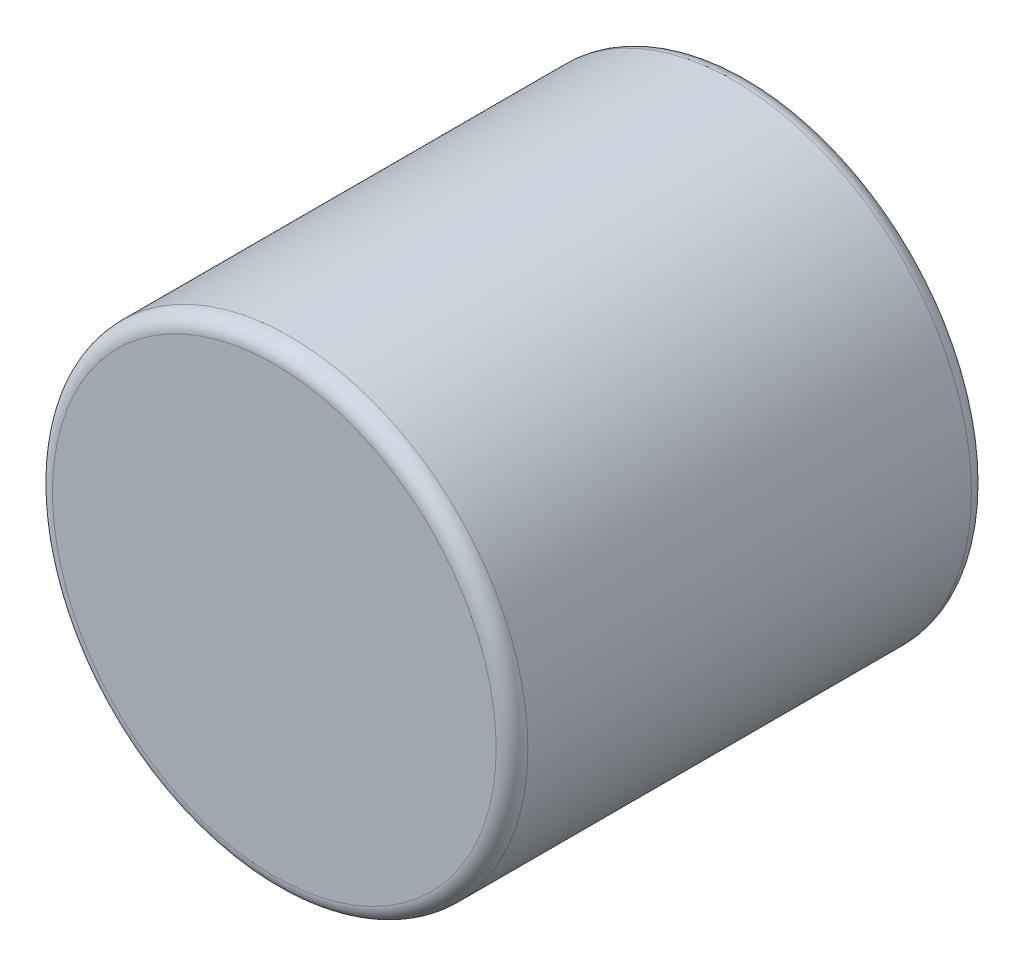
ISO-10303-21;
HEADER;
FILE_DESCRIPTION(('STEP AP214'),'2;1');
FILE_NAME('part.step','',(''),(''),'','','');
FILE_SCHEMA(('AUTOMOTIVE_DESIGN { 1 0 10303 214 1 1 1 1 }'));
ENDSEC;
DATA;
#1=APPLICATION_CONTEXT('core data for automotive mechanical design processes');
#2=APPLICATION_PROTOCOL_DEFINITION('international standard','automotive_design',2000,#1);
#3=PRODUCT_CONTEXT('',#1,'mechanical');
#4=PRODUCT('Part','Part','',(#3));
#5=PRODUCT_RELATED_PRODUCT_CATEGORY('part','',(#4));
#6=PRODUCT_DEFINITION_FORMATION('','',#4);
#7=PRODUCT_DEFINITION_CONTEXT('part definition',#1,'design');
#8=PRODUCT_DEFINITION('design','',#6,#7);
#9=PRODUCT_DEFINITION_SHAPE('','',#8);
#10=(LENGTH_UNIT() NAMED_UNIT(*) SI_UNIT(.MILLI.,.METRE.));
#11=(NAMED_UNIT(*) PLANE_ANGLE_UNIT() SI_UNIT($,.RADIAN.));
#12=(NAMED_UNIT(*) SI_UNIT($,.STERADIAN.) SOLID_ANGLE_UNIT());
#13=UNCERTAINTY_MEASURE_WITH_UNIT(LENGTH_MEASURE(1.E-05),#10,'distance_accuracy_value','');
#14=(GEOMETRIC_REPRESENTATION_CONTEXT(3) GLOBAL_UNCERTAINTY_ASSIGNED_CONTEXT((#13)) GLOBAL_UNIT_ASSIGNED_CONTEXT((#10,
#11,#12)) REPRESENTATION_CONTEXT('',''));
#15=CARTESIAN_POINT('',(0.,0.,0.));
#16=DIRECTION('',(0.,0.,1.));
#17=DIRECTION('',(1.,0.,0.));
#18=AXIS2_PLACEMENT_3D('',#15,#16,#17);
#19=CARTESIAN_POINT('',(0.,0.,30.));
#20=DIRECTION('',(0.,0.,-1.));
#21=DIRECTION('',(-1.,0.,0.));
#22=AXIS2_PLACEMENT_3D('',#19,#20,#21);
#23=CYLINDRICAL_SURFACE('',#22,15.);
#24=CARTESIAN_POINT('',(0.,0.,1.));
#25=DIRECTION('',(0.,0.,1.));
#26=DIRECTION('',(1.,0.,0.));
#27=AXIS2_PLACEMENT_3D('',#24,#25,#26);
#28=CIRCLE('',#27,15.);
#29=CARTESIAN_POINT('',(15.,0.,1.));
#30=VERTEX_POINT('',#29);
#31=EDGE_CURVE('E49',#30,#30,#28,.T.);
#32=ORIENTED_EDGE('',*,*,#31,.T.);
#33=EDGE_LOOP('',(#32));
#34=FACE_BOUND('',#33,.T.);
#35=CARTESIAN_POINT('',(0.,0.,29.));
#36=DIRECTION('',(0.,0.,1.));
#37=DIRECTION('',(1.,0.,0.));
#38=AXIS2_PLACEMENT_3D('',#35,#36,#37);
#39=CIRCLE('',#38,15.);
#40=CARTESIAN_POINT('',(15.,0.,29.));
#41=VERTEX_POINT('',#40);
#42=EDGE_CURVE('E53',#41,#41,#39,.F.);
#43=ORIENTED_EDGE('',*,*,#42,.T.);
#44=EDGE_LOOP('',(#43));
#45=FACE_BOUND('',#44,.T.);
#46=ADVANCED_FACE('F38',(#34,#45),#23,.T.);
#47=CARTESIAN_POINT('',(0.,0.,30.));
#48=DIRECTION('',(0.,0.,1.));
#49=DIRECTION('',(1.,0.,0.));
#50=AXIS2_PLACEMENT_3D('',#47,#48,#49);
#51=PLANE('',#50);
#52=CARTESIAN_POINT('',(0.,0.,30.));
#53=DIRECTION('',(0.,0.,1.));
#54=DIRECTION('',(1.,0.,0.));
#55=AXIS2_PLACEMENT_3D('',#52,#53,#54);
#56=CIRCLE('',#55,14.);
#57=CARTESIAN_POINT('',(14.,0.,30.));
#58=VERTEX_POINT('',#57);
#59=EDGE_CURVE('E10',#58,#58,#56,.T.);
#60=ORIENTED_EDGE('',*,*,#59,.T.);
#61=EDGE_LOOP('',(#60));
#62=FACE_BOUND('',#61,.T.);
#63=ADVANCED_FACE('F83',(#62),#51,.T.);
#64=CARTESIAN_POINT('',(0.,0.,0.));
#65=DIRECTION('',(0.,0.,1.));
#66=DIRECTION('',(1.,0.,0.));
#67=AXIS2_PLACEMENT_3D('',#64,#65,#66);
#68=PLANE('',#67);
#69=CARTESIAN_POINT('',(0.,0.,0.));
#70=DIRECTION('',(0.,0.,-1.));
#71=DIRECTION('',(-1.,0.,0.));
#72=AXIS2_PLACEMENT_3D('',#69,#70,#71);
#73=CIRCLE('',#72,3.);
#74=CARTESIAN_POINT('',(-3.,0.,0.));
#75=VERTEX_POINT('',#74);
#76=EDGE_CURVE('E58',#75,#75,#73,.T.);
#77=ORIENTED_EDGE('',*,*,#76,.F.);
#78=EDGE_LOOP('',(#77));
#79=FACE_BOUND('',#78,.T.);
#80=CARTESIAN_POINT('',(0.,0.,0.));
#81=DIRECTION('',(0.,0.,1.));
#82=DIRECTION('',(1.,0.,0.));
#83=AXIS2_PLACEMENT_3D('',#80,#81,#82);
#84=CIRCLE('',#83,14.);
#85=CARTESIAN_POINT('',(14.,0.,0.));
#86=VERTEX_POINT('',#85);
#87=EDGE_CURVE('E45',#86,#86,#84,.F.);
#88=ORIENTED_EDGE('',*,*,#87,.T.);
#89=EDGE_LOOP('',(#88));
#90=FACE_BOUND('',#89,.T.);
#91=ADVANCED_FACE('F89',(#79,#90),#68,.F.);
#92=CARTESIAN_POINT('',(0.,0.,1.));
#93=DIRECTION('',(0.,0.,1.));
#94=DIRECTION('',(1.,0.,0.));
#95=AXIS2_PLACEMENT_3D('',#92,#93,#94);
#96=TOROIDAL_SURFACE('',#95,14.,1.);
#97=ORIENTED_EDGE('',*,*,#87,.F.);
#98=EDGE_LOOP('',(#97));
#99=FACE_BOUND('',#98,.T.);
#100=ORIENTED_EDGE('',*,*,#31,.F.);
#101=EDGE_LOOP('',(#100));
#102=FACE_BOUND('',#101,.T.);
#103=ADVANCED_FACE('F93',(#99,#102),#96,.T.);
#104=CARTESIAN_POINT('',(0.,0.,29.));
#105=DIRECTION('',(0.,0.,1.));
#106=DIRECTION('',(1.,0.,0.));
#107=AXIS2_PLACEMENT_3D('',#104,#105,#106);
#108=TOROIDAL_SURFACE('',#107,14.,1.);
#109=ORIENTED_EDGE('',*,*,#42,.F.);
#110=EDGE_LOOP('',(#109));
#111=FACE_BOUND('',#110,.T.);
#112=ORIENTED_EDGE('',*,*,#59,.F.);
#113=EDGE_LOOP('',(#112));
#114=FACE_BOUND('',#113,.T.);
#115=ADVANCED_FACE('F40',(#111,#114),#108,.T.);
#116=CARTESIAN_POINT('',(0.,0.,0.));
#117=DIRECTION('',(0.,0.,-1.));
#118=DIRECTION('',(-1.,0.,0.));
#119=AXIS2_PLACEMENT_3D('',#116,#117,#118);
#120=TOROIDAL_SURFACE('',#119,1.5,1.5);
#121=ORIENTED_EDGE('',*,*,#76,.T.);
#122=EDGE_LOOP('',(#121));
#123=FACE_BOUND('',#122,.T.);
#124=CARTESIAN_POINT('',(0.,0.,1.41421356237309));
#125=DIRECTION('',(0.,0.,-1.));
#126=DIRECTION('',(-1.,0.,0.));
#127=AXIS2_PLACEMENT_3D('',#124,#125,#126);
#128=CIRCLE('',#127,2.);
#129=CARTESIAN_POINT('',(-2.,0.,1.41421356237309));
#130=VERTEX_POINT('',#129);
#131=EDGE_CURVE('E61',#130,#130,#128,.T.);
#132=ORIENTED_EDGE('',*,*,#131,.F.);
#133=EDGE_LOOP('',(#132));
#134=FACE_BOUND('',#133,.T.);
#135=ADVANCED_FACE('F72',(#123,#134),#120,.F.);
#136=CARTESIAN_POINT('',(0.,0.,1.07245097824471));
#137=DIRECTION('',(0.,0.,-1.));
#138=DIRECTION('',(-1.,0.,0.));
#139=AXIS2_PLACEMENT_3D('',#136,#137,#138);
#140=DEGENERATE_TOROIDAL_SURFACE('',#139,0.539452727197819,1.5,.T.);
#141=ORIENTED_EDGE('',*,*,#131,.T.);
#142=EDGE_LOOP('',(#141));
#143=FACE_BOUND('',#142,.T.);
#144=CARTESIAN_POINT('',(0.,0.,2.5));
#145=DIRECTION('',(0.,0.,-1.));
#146=DIRECTION('',(-1.,0.,0.));
#147=AXIS2_PLACEMENT_3D('',#144,#145,#146);
#148=CIRCLE('',#147,1.);
#149=CARTESIAN_POINT('',(-1.,0.,2.5));
#150=VERTEX_POINT('',#149);
#151=EDGE_CURVE('E64',#150,#150,#148,.T.);
#152=ORIENTED_EDGE('',*,*,#151,.F.);
#153=EDGE_LOOP('',(#152));
#154=FACE_BOUND('',#153,.T.);
#155=ADVANCED_FACE('F70',(#143,#154),#140,.F.);
#156=CARTESIAN_POINT('',(0.,0.,2.5));
#157=DIRECTION('',(0.,0.,-1.));
#158=DIRECTION('',(1.,0.,0.));
#159=AXIS2_PLACEMENT_3D('',#156,#157,#158);
#160=SPHERICAL_SURFACE('',#159,1.);
#161=ORIENTED_EDGE('',*,*,#151,.T.);
#162=EDGE_LOOP('',(#161));
#163=FACE_BOUND('',#162,.T.);
#164=ADVANCED_FACE('F68',(#163),#160,.T.);
#165=CLOSED_SHELL('',(#46,#63,#91,#103,#115,#135,#155,#164));
#166=MANIFOLD_SOLID_BREP('B2',#165);
#167=ADVANCED_BREP_SHAPE_REPRESENTATION('',(#18,#166),#14);
#168=SHAPE_DEFINITION_REPRESENTATION(#9,#167);
ENDSEC;
END-ISO-10303-21;
